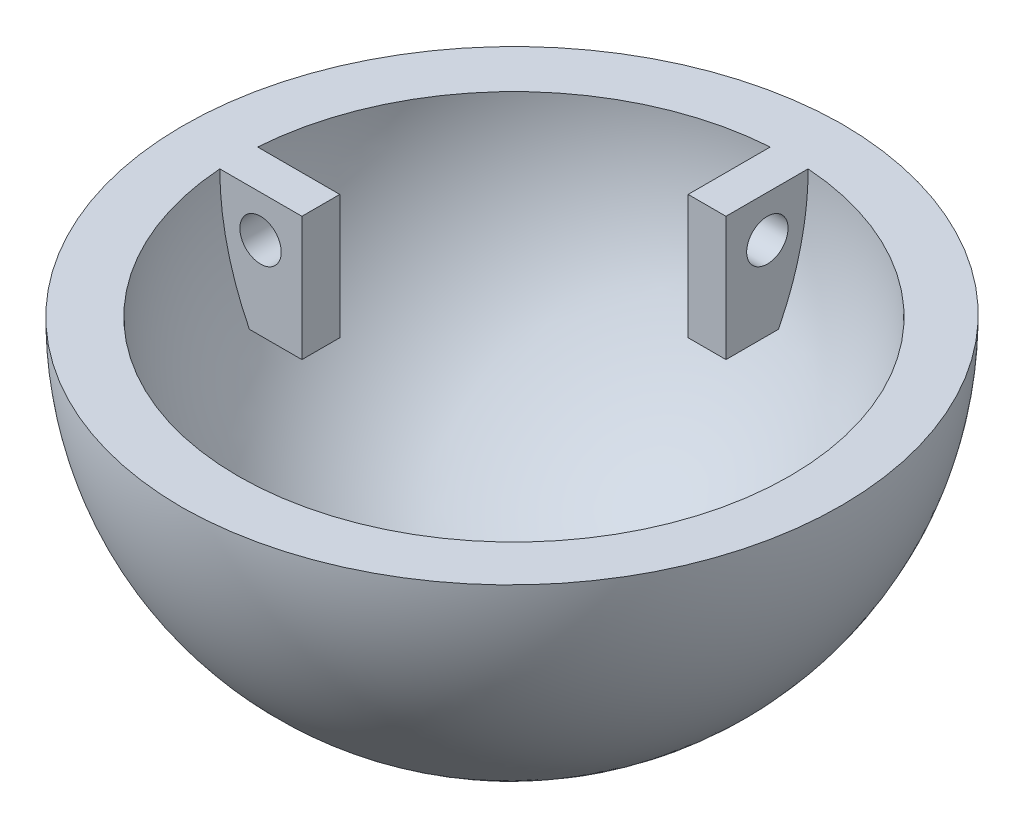
ISO-10303-21;
HEADER;
FILE_DESCRIPTION(('STEP AP214'),'2;1');
FILE_NAME('part.step','',(''),(''),'','','');
FILE_SCHEMA(('AUTOMOTIVE_DESIGN { 1 0 10303 214 1 1 1 1 }'));
ENDSEC;
DATA;
#1=APPLICATION_CONTEXT('core data for automotive mechanical design processes');
#2=APPLICATION_PROTOCOL_DEFINITION('international standard','automotive_design',2000,#1);
#3=PRODUCT_CONTEXT('',#1,'mechanical');
#4=PRODUCT('Part','Part','',(#3));
#5=PRODUCT_RELATED_PRODUCT_CATEGORY('part','',(#4));
#6=PRODUCT_DEFINITION_FORMATION('','',#4);
#7=PRODUCT_DEFINITION_CONTEXT('part definition',#1,'design');
#8=PRODUCT_DEFINITION('design','',#6,#7);
#9=PRODUCT_DEFINITION_SHAPE('','',#8);
#10=(LENGTH_UNIT() NAMED_UNIT(*) SI_UNIT(.MILLI.,.METRE.));
#11=(NAMED_UNIT(*) PLANE_ANGLE_UNIT() SI_UNIT($,.RADIAN.));
#12=(NAMED_UNIT(*) SI_UNIT($,.STERADIAN.) SOLID_ANGLE_UNIT());
#13=UNCERTAINTY_MEASURE_WITH_UNIT(LENGTH_MEASURE(1.E-05),#10,'distance_accuracy_value','');
#14=(GEOMETRIC_REPRESENTATION_CONTEXT(3) GLOBAL_UNCERTAINTY_ASSIGNED_CONTEXT((#13)) GLOBAL_UNIT_ASSIGNED_CONTEXT((#10,
#11,#12)) REPRESENTATION_CONTEXT('',''));
#15=CARTESIAN_POINT('',(0.,0.,0.));
#16=DIRECTION('',(0.,0.,1.));
#17=DIRECTION('',(1.,0.,0.));
#18=AXIS2_PLACEMENT_3D('',#15,#16,#17);
#19=CARTESIAN_POINT('',(-0.140159160321102,0.,0.000818552510422482));
#20=DIRECTION('',(0.,-1.,0.));
#21=DIRECTION('',(0.0116799300267585,0.,0.999931787290798));
#22=AXIS2_PLACEMENT_3D('',#19,#20,#21);
#23=PLANE('',#22);
#24=CARTESIAN_POINT('',(0.,0.,0.));
#25=DIRECTION('',(0.,-1.,0.));
#26=DIRECTION('',(1.,0.,0.));
#27=AXIS2_PLACEMENT_3D('',#24,#25,#26);
#28=CIRCLE('',#27,10.);
#29=CARTESIAN_POINT('',(-0.685861167093749,0.,-9.97645199755268));
#30=VERTEX_POINT('',#29);
#31=CARTESIAN_POINT('',(-9.97645199755268,0.,-0.685861167093786));
#32=VERTEX_POINT('',#31);
#33=EDGE_CURVE('E177',#30,#32,#28,.F.);
#34=ORIENTED_EDGE('',*,*,#33,.F.);
#35=DIRECTION('',(0.,0.,1.));
#36=VECTOR('',#35,1.);
#37=CARTESIAN_POINT('',(-0.685861167093705,0.,-10.9997953601275));
#38=LINE('',#37,#36);
#39=CARTESIAN_POINT('',(-0.685861167093876,0.,-6.99979536012751));
#40=VERTEX_POINT('',#39);
#41=EDGE_CURVE('E140',#30,#40,#38,.T.);
#42=ORIENTED_EDGE('',*,*,#41,.T.);
#43=DIRECTION('',(1.,0.,0.));
#44=VECTOR('',#43,1.);
#45=CARTESIAN_POINT('',(-0.685861167093876,0.,-6.99979536012751));
#46=LINE('',#45,#44);
#47=CARTESIAN_POINT('',(0.685861167093925,0.,-6.9997953601275));
#48=VERTEX_POINT('',#47);
#49=EDGE_CURVE('E126',#40,#48,#46,.T.);
#50=ORIENTED_EDGE('',*,*,#49,.T.);
#51=DIRECTION('',(0.,0.,-1.));
#52=VECTOR('',#51,1.);
#53=CARTESIAN_POINT('',(0.685861167093789,0.,-10.9997953601275));
#54=LINE('',#53,#52);
#55=CARTESIAN_POINT('',(0.685861167093823,0.,-9.97645199755268));
#56=VERTEX_POINT('',#55);
#57=EDGE_CURVE('E120',#48,#56,#54,.T.);
#58=ORIENTED_EDGE('',*,*,#57,.T.);
#59=CARTESIAN_POINT('',(-9.97645199755268,0.,0.685861167093786));
#60=VERTEX_POINT('',#59);
#61=EDGE_CURVE('E185',#60,#56,#28,.F.);
#62=ORIENTED_EDGE('',*,*,#61,.F.);
#63=DIRECTION('',(1.,0.,0.));
#64=VECTOR('',#63,1.);
#65=CARTESIAN_POINT('',(-10.9997953601275,0.,0.685861167093747));
#66=LINE('',#65,#64);
#67=CARTESIAN_POINT('',(-6.9997953601275,0.,0.685861167093901));
#68=VERTEX_POINT('',#67);
#69=EDGE_CURVE('E150',#60,#68,#66,.T.);
#70=ORIENTED_EDGE('',*,*,#69,.T.);
#71=DIRECTION('',(0.,0.,-1.));
#72=VECTOR('',#71,1.);
#73=CARTESIAN_POINT('',(-6.9997953601275,0.,0.685861167093901));
#74=LINE('',#73,#72);
#75=CARTESIAN_POINT('',(-6.9997953601275,0.,-0.685861167093901));
#76=VERTEX_POINT('',#75);
#77=EDGE_CURVE('E167',#68,#76,#74,.T.);
#78=ORIENTED_EDGE('',*,*,#77,.T.);
#79=DIRECTION('',(-1.,0.,0.));
#80=VECTOR('',#79,1.);
#81=CARTESIAN_POINT('',(-10.9997953601275,0.,-0.685861167093747));
#82=LINE('',#81,#80);
#83=EDGE_CURVE('E156',#76,#32,#82,.T.);
#84=ORIENTED_EDGE('',*,*,#83,.T.);
#85=EDGE_LOOP('',(#34,#42,#50,#58,#62,#70,#78,#84));
#86=FACE_BOUND('',#85,.T.);
#87=CARTESIAN_POINT('',(-0.140159160321102,0.,0.000818552510422482));
#88=DIRECTION('',(0.,-1.,0.));
#89=DIRECTION('',(0.0116799300267585,0.,0.999931787290798));
#90=AXIS2_PLACEMENT_3D('',#87,#88,#89);
#91=CIRCLE('',#90,12.);
#92=CARTESIAN_POINT('',(-0.140159160321102,0.,-11.9991814474896));
#93=VERTEX_POINT('',#92);
#94=CARTESIAN_POINT('',(0.,0.,12.));
#95=VERTEX_POINT('',#94);
#96=EDGE_CURVE('E184',#93,#95,#91,.T.);
#97=ORIENTED_EDGE('',*,*,#96,.F.);
#98=CARTESIAN_POINT('',(0.,0.,0.));
#99=DIRECTION('',(0.,1.,0.));
#100=DIRECTION('',(0.,0.,1.));
#101=AXIS2_PLACEMENT_3D('',#98,#99,#100);
#102=CIRCLE('',#101,12.);
#103=EDGE_CURVE('E181',#93,#95,#102,.T.);
#104=ORIENTED_EDGE('',*,*,#103,.T.);
#105=EDGE_LOOP('',(#97,#104));
#106=FACE_BOUND('',#105,.T.);
#107=ADVANCED_FACE('F41',(#86,#106),#23,.F.);
#108=CARTESIAN_POINT('',(0.,0.,0.));
#109=DIRECTION('',(0.,-1.,0.));
#110=DIRECTION('',(-0.999982946677292,0.,0.00584006460588562));
#111=AXIS2_PLACEMENT_3D('',#108,#109,#110);
#112=CIRCLE('',#111,12.);
#113=TRIMMED_CURVE('',#112,(PARAMETER_VALUE(-1.56495622899128)),
(PARAMETER_VALUE(1.56495622899128)),.T.,.PARAMETER.);
#114=CARTESIAN_POINT('',(-0.0700795801605511,0.,0.000409276255212976));
#115=DIRECTION('',(-0.00584006460588562,0.,-0.999982946677292));
#116=AXIS1_PLACEMENT('',#114,#115);
#117=SURFACE_OF_REVOLUTION('',#113,#116);
#118=ORIENTED_EDGE('',*,*,#96,.T.);
#119=ORIENTED_EDGE('',*,*,#103,.F.);
#120=EDGE_LOOP('',(#118,#119));
#121=FACE_BOUND('',#120,.T.);
#122=ADVANCED_FACE('F43',(#121),#117,.T.);
#123=CARTESIAN_POINT('',(0.,0.,0.));
#124=DIRECTION('',(0.,0.,1.));
#125=DIRECTION('',(-1.,0.,0.));
#126=AXIS2_PLACEMENT_3D('',#123,#124,#125);
#127=SPHERICAL_SURFACE('',#126,10.);
#128=CARTESIAN_POINT('',(-0.685861167094176,0.,0.));
#129=DIRECTION('',(-1.,0.,0.));
#130=DIRECTION('',(0.,0.,1.));
#131=AXIS2_PLACEMENT_3D('',#128,#129,#130);
#132=CIRCLE('',#131,9.97645199755265);
#133=CARTESIAN_POINT('',(-0.685861167093763,-4.5,-8.9039089426764));
#134=VERTEX_POINT('',#133);
#135=EDGE_CURVE('E11',#30,#134,#132,.T.);
#136=ORIENTED_EDGE('',*,*,#135,.F.);
#137=ORIENTED_EDGE('',*,*,#33,.T.);
#138=CARTESIAN_POINT('',(0.,0.,-0.68586116709417));
#139=DIRECTION('',(0.,0.,-1.));
#140=DIRECTION('',(-1.,0.,0.));
#141=AXIS2_PLACEMENT_3D('',#138,#139,#140);
#142=CIRCLE('',#141,9.97645199755265);
#143=CARTESIAN_POINT('',(-8.90390894267637,-4.50000000000006,-0.685861167093828));
#144=VERTEX_POINT('',#143);
#145=EDGE_CURVE('E199',#144,#32,#142,.T.);
#146=ORIENTED_EDGE('',*,*,#145,.F.);
#147=CARTESIAN_POINT('',(0.,-4.5,0.));
#148=DIRECTION('',(0.,-1.,0.));
#149=DIRECTION('',(1.,0.,0.));
#150=AXIS2_PLACEMENT_3D('',#147,#148,#149);
#151=CIRCLE('',#150,8.93028554974588);
#152=CARTESIAN_POINT('',(-8.90390894267637,-4.50000000000006,0.685861167093827));
#153=VERTEX_POINT('',#152);
#154=EDGE_CURVE('E189',#153,#144,#151,.T.);
#155=ORIENTED_EDGE('',*,*,#154,.F.);
#156=CARTESIAN_POINT('',(0.,0.,0.68586116709417));
#157=DIRECTION('',(0.,0.,1.));
#158=DIRECTION('',(1.,0.,0.));
#159=AXIS2_PLACEMENT_3D('',#156,#157,#158);
#160=CIRCLE('',#159,9.97645199755265);
#161=EDGE_CURVE('E195',#60,#153,#160,.T.);
#162=ORIENTED_EDGE('',*,*,#161,.F.);
#163=ORIENTED_EDGE('',*,*,#61,.T.);
#164=CARTESIAN_POINT('',(0.685861167094164,0.,0.));
#165=DIRECTION('',(1.,0.,0.));
#166=DIRECTION('',(0.,0.,-1.));
#167=AXIS2_PLACEMENT_3D('',#164,#165,#166);
#168=CIRCLE('',#167,9.97645199755265);
#169=CARTESIAN_POINT('',(0.685861167093892,-4.49999999999999,-8.9039089426764));
#170=VERTEX_POINT('',#169);
#171=EDGE_CURVE('E50',#170,#56,#168,.T.);
#172=ORIENTED_EDGE('',*,*,#171,.F.);
#173=CARTESIAN_POINT('',(0.,-4.5,0.));
#174=DIRECTION('',(0.,1.,0.));
#175=DIRECTION('',(-1.,0.,0.));
#176=AXIS2_PLACEMENT_3D('',#173,#174,#175);
#177=CIRCLE('',#176,8.93028554974588);
#178=EDGE_CURVE('E57',#170,#134,#177,.T.);
#179=ORIENTED_EDGE('',*,*,#178,.T.);
#180=EDGE_LOOP('',(#136,#137,#146,#155,#162,#163,#172,#179));
#181=FACE_BOUND('',#180,.T.);
#182=ADVANCED_FACE('F213',(#181),#127,.F.);
#183=CARTESIAN_POINT('',(-10.9997953601275,-4.50000000000008,-0.685861167093747));
#184=DIRECTION('',(0.,0.,-1.));
#185=DIRECTION('',(-1.,0.,0.));
#186=AXIS2_PLACEMENT_3D('',#183,#184,#185);
#187=PLANE('',#186);
#188=CARTESIAN_POINT('',(-8.49979536012753,-1.50000000000005,-0.685861167094497));
#189=DIRECTION('',(0.,0.,-1.));
#190=DIRECTION('',(-1.,0.,0.));
#191=AXIS2_PLACEMENT_3D('',#188,#189,#190);
#192=CIRCLE('',#191,0.75);
#193=CARTESIAN_POINT('',(-9.24979536012753,-1.50000000000005,-0.685861167094527));
#194=VERTEX_POINT('',#193);
#195=EDGE_CURVE('E143',#194,#194,#192,.T.);
#196=ORIENTED_EDGE('',*,*,#195,.F.);
#197=EDGE_LOOP('',(#196));
#198=FACE_BOUND('',#197,.T.);
#199=DIRECTION('',(-1.,0.,0.));
#200=VECTOR('',#199,1.);
#201=CARTESIAN_POINT('',(-10.9997953601275,-4.50000000000008,-0.685861167093747));
#202=LINE('',#201,#200);
#203=CARTESIAN_POINT('',(-6.99979536012747,-4.50000000000005,-0.685861167093901));
#204=VERTEX_POINT('',#203);
#205=EDGE_CURVE('E160',#204,#144,#202,.T.);
#206=ORIENTED_EDGE('',*,*,#205,.T.);
#207=ORIENTED_EDGE('',*,*,#145,.T.);
#208=ORIENTED_EDGE('',*,*,#83,.F.);
#209=DIRECTION('',(0.,1.,0.));
#210=VECTOR('',#209,1.);
#211=CARTESIAN_POINT('',(-6.99979536012747,-4.50000000000005,-0.685861167093901));
#212=LINE('',#211,#210);
#213=EDGE_CURVE('E174',#204,#76,#212,.T.);
#214=ORIENTED_EDGE('',*,*,#213,.F.);
#215=EDGE_LOOP('',(#206,#207,#208,#214));
#216=FACE_BOUND('',#215,.T.);
#217=ADVANCED_FACE('F215',(#198,#216),#187,.T.);
#218=CARTESIAN_POINT('',(-10.9997953601275,-4.50000000000008,0.685861167093747));
#219=DIRECTION('',(0.,0.,1.));
#220=DIRECTION('',(1.,0.,0.));
#221=AXIS2_PLACEMENT_3D('',#218,#219,#220);
#222=PLANE('',#221);
#223=CARTESIAN_POINT('',(-8.49979536012758,-1.50000000000005,0.685861167093843));
#224=DIRECTION('',(0.,0.,1.));
#225=DIRECTION('',(1.,0.,0.));
#226=AXIS2_PLACEMENT_3D('',#223,#224,#225);
#227=CIRCLE('',#226,0.75);
#228=CARTESIAN_POINT('',(-9.24979536012758,-1.50000000000005,0.685861167093816));
#229=VERTEX_POINT('',#228);
#230=EDGE_CURVE('E349',#229,#229,#227,.F.);
#231=ORIENTED_EDGE('',*,*,#230,.T.);
#232=EDGE_LOOP('',(#231));
#233=FACE_BOUND('',#232,.T.);
#234=ORIENTED_EDGE('',*,*,#69,.F.);
#235=ORIENTED_EDGE('',*,*,#161,.T.);
#236=DIRECTION('',(1.,0.,0.));
#237=VECTOR('',#236,1.);
#238=CARTESIAN_POINT('',(-10.9997953601275,-4.50000000000008,0.685861167093747));
#239=LINE('',#238,#237);
#240=CARTESIAN_POINT('',(-6.99979536012747,-4.50000000000005,0.685861167093901));
#241=VERTEX_POINT('',#240);
#242=EDGE_CURVE('E152',#153,#241,#239,.T.);
#243=ORIENTED_EDGE('',*,*,#242,.T.);
#244=DIRECTION('',(0.,1.,0.));
#245=VECTOR('',#244,1.);
#246=CARTESIAN_POINT('',(-6.99979536012747,-4.50000000000005,0.685861167093901));
#247=LINE('',#246,#245);
#248=EDGE_CURVE('E164',#241,#68,#247,.T.);
#249=ORIENTED_EDGE('',*,*,#248,.T.);
#250=EDGE_LOOP('',(#234,#235,#243,#249));
#251=FACE_BOUND('',#250,.T.);
#252=ADVANCED_FACE('F221',(#233,#251),#222,.T.);
#253=CARTESIAN_POINT('',(0.,-4.5,0.));
#254=DIRECTION('',(0.,-1.,0.));
#255=DIRECTION('',(1.,0.,0.));
#256=AXIS2_PLACEMENT_3D('',#253,#254,#255);
#257=PLANE('',#256);
#258=ORIENTED_EDGE('',*,*,#242,.F.);
#259=ORIENTED_EDGE('',*,*,#154,.T.);
#260=ORIENTED_EDGE('',*,*,#205,.F.);
#261=DIRECTION('',(0.,0.,-1.));
#262=VECTOR('',#261,1.);
#263=CARTESIAN_POINT('',(-6.99979536012747,-4.50000000000005,0.685861167093901));
#264=LINE('',#263,#262);
#265=EDGE_CURVE('E155',#241,#204,#264,.T.);
#266=ORIENTED_EDGE('',*,*,#265,.F.);
#267=EDGE_LOOP('',(#258,#259,#260,#266));
#268=FACE_BOUND('',#267,.T.);
#269=ADVANCED_FACE('F266',(#268),#257,.T.);
#270=CARTESIAN_POINT('',(-6.99979536012747,-4.50000000000005,0.685861167093901));
#271=DIRECTION('',(1.,0.,0.));
#272=DIRECTION('',(0.,1.,0.));
#273=AXIS2_PLACEMENT_3D('',#270,#271,#272);
#274=PLANE('',#273);
#275=ORIENTED_EDGE('',*,*,#77,.F.);
#276=ORIENTED_EDGE('',*,*,#248,.F.);
#277=ORIENTED_EDGE('',*,*,#265,.T.);
#278=ORIENTED_EDGE('',*,*,#213,.T.);
#279=EDGE_LOOP('',(#275,#276,#277,#278));
#280=FACE_BOUND('',#279,.T.);
#281=ADVANCED_FACE('F274',(#280),#274,.T.);
#282=CARTESIAN_POINT('',(-0.685861167093674,-4.5,-10.9997953601275));
#283=DIRECTION('',(-1.,0.,0.));
#284=DIRECTION('',(0.,0.,1.));
#285=AXIS2_PLACEMENT_3D('',#282,#283,#284);
#286=PLANE('',#285);
#287=CARTESIAN_POINT('',(-0.685861167093802,-1.5,-8.49979536012746));
#288=DIRECTION('',(-1.,0.,0.));
#289=DIRECTION('',(0.,0.,1.));
#290=AXIS2_PLACEMENT_3D('',#287,#288,#289);
#291=CIRCLE('',#290,0.75);
#292=CARTESIAN_POINT('',(-0.685861167093769,-1.5,-9.24979536012746));
#293=VERTEX_POINT('',#292);
#294=EDGE_CURVE('E344',#293,#293,#291,.F.);
#295=ORIENTED_EDGE('',*,*,#294,.T.);
#296=EDGE_LOOP('',(#295));
#297=FACE_BOUND('',#296,.T.);
#298=ORIENTED_EDGE('',*,*,#41,.F.);
#299=ORIENTED_EDGE('',*,*,#135,.T.);
#300=DIRECTION('',(0.,0.,1.));
#301=VECTOR('',#300,1.);
#302=CARTESIAN_POINT('',(-0.685861167093674,-4.5,-10.9997953601275));
#303=LINE('',#302,#301);
#304=CARTESIAN_POINT('',(-0.685861167093845,-4.5,-6.99979536012751));
#305=VERTEX_POINT('',#304);
#306=EDGE_CURVE('E110',#134,#305,#303,.T.);
#307=ORIENTED_EDGE('',*,*,#306,.T.);
#308=DIRECTION('',(0.,1.,0.));
#309=VECTOR('',#308,1.);
#310=CARTESIAN_POINT('',(-0.685861167093845,-4.5,-6.99979536012751));
#311=LINE('',#310,#309);
#312=EDGE_CURVE('E114',#305,#40,#311,.T.);
#313=ORIENTED_EDGE('',*,*,#312,.T.);
#314=EDGE_LOOP('',(#298,#299,#307,#313));
#315=FACE_BOUND('',#314,.T.);
#316=ADVANCED_FACE('F113',(#297,#315),#286,.T.);
#317=CARTESIAN_POINT('',(0.68586116709382,-4.49999999999999,-10.9997953601275));
#318=DIRECTION('',(1.,0.,0.));
#319=DIRECTION('',(0.,0.,-1.));
#320=AXIS2_PLACEMENT_3D('',#317,#318,#319);
#321=PLANE('',#320);
#322=CARTESIAN_POINT('',(0.685861167093884,-1.49999999999999,-8.4997953601275));
#323=DIRECTION('',(1.,0.,0.));
#324=DIRECTION('',(0.,0.,-1.));
#325=AXIS2_PLACEMENT_3D('',#322,#323,#324);
#326=CIRCLE('',#325,0.75);
#327=CARTESIAN_POINT('',(0.685861167093859,-1.49999999999999,-9.2497953601275));
#328=VERTEX_POINT('',#327);
#329=EDGE_CURVE('E347',#328,#328,#326,.T.);
#330=ORIENTED_EDGE('',*,*,#329,.F.);
#331=EDGE_LOOP('',(#330));
#332=FACE_BOUND('',#331,.T.);
#333=DIRECTION('',(0.,0.,-1.));
#334=VECTOR('',#333,1.);
#335=CARTESIAN_POINT('',(0.68586116709382,-4.49999999999999,-10.9997953601275));
#336=LINE('',#335,#334);
#337=CARTESIAN_POINT('',(0.685861167093957,-4.49999999999999,-6.9997953601275));
#338=VERTEX_POINT('',#337);
#339=EDGE_CURVE('E129',#338,#170,#336,.T.);
#340=ORIENTED_EDGE('',*,*,#339,.T.);
#341=ORIENTED_EDGE('',*,*,#171,.T.);
#342=ORIENTED_EDGE('',*,*,#57,.F.);
#343=DIRECTION('',(0.,1.,0.));
#344=VECTOR('',#343,1.);
#345=CARTESIAN_POINT('',(0.685861167093957,-4.49999999999999,-6.9997953601275));
#346=LINE('',#345,#344);
#347=EDGE_CURVE('E128',#338,#48,#346,.T.);
#348=ORIENTED_EDGE('',*,*,#347,.F.);
#349=EDGE_LOOP('',(#340,#341,#342,#348));
#350=FACE_BOUND('',#349,.T.);
#351=ADVANCED_FACE('F207',(#332,#350),#321,.T.);
#352=CARTESIAN_POINT('',(0.,-4.5,0.));
#353=DIRECTION('',(0.,1.,0.));
#354=DIRECTION('',(-1.,0.,0.));
#355=AXIS2_PLACEMENT_3D('',#352,#353,#354);
#356=PLANE('',#355);
#357=ORIENTED_EDGE('',*,*,#178,.F.);
#358=ORIENTED_EDGE('',*,*,#339,.F.);
#359=DIRECTION('',(1.,0.,0.));
#360=VECTOR('',#359,1.);
#361=CARTESIAN_POINT('',(-0.685861167093845,-4.5,-6.99979536012751));
#362=LINE('',#361,#360);
#363=EDGE_CURVE('E119',#305,#338,#362,.T.);
#364=ORIENTED_EDGE('',*,*,#363,.F.);
#365=ORIENTED_EDGE('',*,*,#306,.F.);
#366=EDGE_LOOP('',(#357,#358,#364,#365));
#367=FACE_BOUND('',#366,.T.);
#368=ADVANCED_FACE('F132',(#367),#356,.F.);
#369=CARTESIAN_POINT('',(-0.685861167093845,-4.5,-6.99979536012751));
#370=DIRECTION('',(0.,0.,1.));
#371=DIRECTION('',(1.,0.,0.));
#372=AXIS2_PLACEMENT_3D('',#369,#370,#371);
#373=PLANE('',#372);
#374=ORIENTED_EDGE('',*,*,#49,.F.);
#375=ORIENTED_EDGE('',*,*,#312,.F.);
#376=ORIENTED_EDGE('',*,*,#363,.T.);
#377=ORIENTED_EDGE('',*,*,#347,.T.);
#378=EDGE_LOOP('',(#374,#375,#376,#377));
#379=FACE_BOUND('',#378,.T.);
#380=ADVANCED_FACE('F124',(#379),#373,.T.);
#381=CARTESIAN_POINT('',(-8.49979536012801,-1.50000000000005,12.0010000000001));
#382=DIRECTION('',(0.,0.,-1.));
#383=DIRECTION('',(-1.,0.,0.));
#384=AXIS2_PLACEMENT_3D('',#381,#382,#383);
#385=CYLINDRICAL_SURFACE('',#384,0.75);
#386=CARTESIAN_POINT('',(-9.24979536012758,-1.50000000000005,0.685861167093816));
#387=CARTESIAN_POINT('',(-9.24979536012758,-1.50000000000005,0.671572392779353));
#388=CARTESIAN_POINT('',(-9.24979536012758,-1.50000000000005,0.657283618464891));
#389=CARTESIAN_POINT('',(-9.24979536012758,-1.50000000000005,0.628706069835968));
#390=CARTESIAN_POINT('',(-9.24979536012757,-1.50000000000005,0.614417295521506));
#391=CARTESIAN_POINT('',(-9.24979536012757,-1.50000000000005,0.585839746892583));
#392=CARTESIAN_POINT('',(-9.24979536012757,-1.50000000000005,0.57155097257812));
#393=CARTESIAN_POINT('',(-9.24979536012757,-1.50000000000005,0.542973423949197));
#394=CARTESIAN_POINT('',(-9.24979536012757,-1.50000000000005,0.528684649634735));
#395=CARTESIAN_POINT('',(-9.24979536012757,-1.50000000000005,0.500107101005812));
#396=CARTESIAN_POINT('',(-9.24979536012757,-1.50000000000005,0.485818326691349));
#397=CARTESIAN_POINT('',(-9.24979536012757,-1.50000000000005,0.457240778062425));
#398=CARTESIAN_POINT('',(-9.24979536012757,-1.50000000000005,0.442952003747963));
#399=CARTESIAN_POINT('',(-9.24979536012757,-1.50000000000005,0.414374455119039));
#400=CARTESIAN_POINT('',(-9.24979536012757,-1.50000000000005,0.400085680804578));
#401=CARTESIAN_POINT('',(-9.24979536012757,-1.50000000000005,0.371508132175654));
#402=CARTESIAN_POINT('',(-9.24979536012756,-1.50000000000005,0.357219357861192));
#403=CARTESIAN_POINT('',(-9.24979536012756,-1.50000000000005,0.328641809232268));
#404=CARTESIAN_POINT('',(-9.24979536012756,-1.50000000000005,0.314353034917806));
#405=CARTESIAN_POINT('',(-9.24979536012756,-1.50000000000005,0.285775486288882));
#406=CARTESIAN_POINT('',(-9.24979536012756,-1.50000000000005,0.271486711974421));
#407=CARTESIAN_POINT('',(-9.24979536012756,-1.50000000000005,0.242909163345497));
#408=CARTESIAN_POINT('',(-9.24979536012756,-1.50000000000005,0.228620389031035));
#409=CARTESIAN_POINT('',(-9.24979536012756,-1.50000000000005,0.200042840402111));
#410=CARTESIAN_POINT('',(-9.24979536012756,-1.50000000000005,0.185754066087648));
#411=CARTESIAN_POINT('',(-9.24979536012756,-1.50000000000005,0.157176517458725));
#412=CARTESIAN_POINT('',(-9.24979536012756,-1.50000000000005,0.142887743144263));
#413=CARTESIAN_POINT('',(-9.24979536012756,-1.50000000000005,0.11431019451534));
#414=CARTESIAN_POINT('',(-9.24979536012756,-1.50000000000005,0.100021420200877));
#415=CARTESIAN_POINT('',(-9.24979536012756,-1.50000000000005,0.0714438715719538));
#416=CARTESIAN_POINT('',(-9.24979536012756,-1.50000000000005,0.0571550972574923));
#417=CARTESIAN_POINT('',(-9.24979536012756,-1.50000000000005,0.0285775486285686));
#418=CARTESIAN_POINT('',(-9.24979536012755,-1.50000000000005,0.0142887743141065));
#419=CARTESIAN_POINT('',(-9.24979536012755,-1.50000000000005,-0.0142887743148177));
#420=CARTESIAN_POINT('',(-9.24979536012755,-1.50000000000005,-0.0285775486292799));
#421=CARTESIAN_POINT('',(-9.24979536012755,-1.50000000000005,-0.0571550972582035));
#422=CARTESIAN_POINT('',(-9.24979536012755,-1.50000000000005,-0.071443871572665));
#423=CARTESIAN_POINT('',(-9.24979536012755,-1.50000000000005,-0.100021420201589));
#424=CARTESIAN_POINT('',(-9.24979536012755,-1.50000000000005,-0.114310194516051));
#425=CARTESIAN_POINT('',(-9.24979536012755,-1.50000000000005,-0.142887743144974));
#426=CARTESIAN_POINT('',(-9.24979536012755,-1.50000000000005,-0.157176517459436));
#427=CARTESIAN_POINT('',(-9.24979536012755,-1.50000000000005,-0.18575406608836));
#428=CARTESIAN_POINT('',(-9.24979536012754,-1.50000000000005,-0.200042840402822));
#429=CARTESIAN_POINT('',(-9.24979536012754,-1.50000000000005,-0.228620389031746));
#430=CARTESIAN_POINT('',(-9.24979536012754,-1.50000000000005,-0.242909163346208));
#431=CARTESIAN_POINT('',(-9.24979536012754,-1.50000000000005,-0.271486711975132));
#432=CARTESIAN_POINT('',(-9.24979536012754,-1.50000000000005,-0.285775486289593));
#433=CARTESIAN_POINT('',(-9.24979536012754,-1.50000000000005,-0.314353034918517));
#434=CARTESIAN_POINT('',(-9.24979536012754,-1.50000000000005,-0.328641809232979));
#435=CARTESIAN_POINT('',(-9.24979536012754,-1.50000000000005,-0.357219357861903));
#436=CARTESIAN_POINT('',(-9.24979536012754,-1.50000000000005,-0.371508132176365));
#437=CARTESIAN_POINT('',(-9.24979536012754,-1.50000000000005,-0.400085680805289));
#438=CARTESIAN_POINT('',(-9.24979536012754,-1.50000000000005,-0.414374455119751));
#439=CARTESIAN_POINT('',(-9.24979536012754,-1.50000000000005,-0.442952003748674));
#440=CARTESIAN_POINT('',(-9.24979536012753,-1.50000000000005,-0.457240778063136));
#441=CARTESIAN_POINT('',(-9.24979536012753,-1.50000000000005,-0.485818326692061));
#442=CARTESIAN_POINT('',(-9.24979536012753,-1.50000000000005,-0.500107101006523));
#443=CARTESIAN_POINT('',(-9.24979536012753,-1.50000000000005,-0.528684649635446));
#444=CARTESIAN_POINT('',(-9.24979536012753,-1.50000000000005,-0.542973423949908));
#445=CARTESIAN_POINT('',(-9.24979536012753,-1.50000000000005,-0.571550972578832));
#446=CARTESIAN_POINT('',(-9.24979536012753,-1.50000000000005,-0.585839746893294));
#447=CARTESIAN_POINT('',(-9.24979536012753,-1.50000000000005,-0.614417295522217));
#448=CARTESIAN_POINT('',(-9.24979536012753,-1.50000000000005,-0.628706069836679));
#449=CARTESIAN_POINT('',(-9.24979536012753,-1.50000000000005,-0.657283618465603));
#450=CARTESIAN_POINT('',(-9.24979536012753,-1.50000000000005,-0.671572392780065));
#451=CARTESIAN_POINT('',(-9.24979536012753,-1.50000000000005,-0.685861167094527));
#452=B_SPLINE_CURVE_WITH_KNOTS('',3,(#386,#387,#388,#389,#390,#391,#392,#393,#394,#395,#396,
#397,#398,#399,#400,#401,#402,#403,#404,#405,#406,#407,#408,#409,#410,#411,#412,#413,#414,#415,
#416,#417,#418,#419,#420,#421,#422,#423,#424,#425,#426,#427,#428,#429,#430,#431,#432,#433,#434,
#435,#436,#437,#438,#439,#440,#441,#442,#443,#444,#445,#446,#447,#448,#449,#450,#451),
.UNSPECIFIED.,.F.,.F.,(4,2,2,2,2,2,2,2,2,2,2,2,2,2,2,2,2,2,2,2,2,2,2,2,2,2,2,2,2,2,2,2,4),(0.,
0.0428663229433864,0.085732645886771,0.128598968830157,0.171465291773542,0.214331614716928,
0.257197937660315,0.300064260603699,0.342930583547086,0.385796906490472,0.428663229433857,
0.471529552377243,0.514395875320629,0.557262198264014,0.6001285212074,0.642994844150785,
0.685861167094171,0.728727490037558,0.771593812980942,0.814460135924329,0.857326458867713,
0.9001927818111,0.943059104754486,0.985925427697871,1.02879175064126,1.07165807358464,
1.11452439652803,1.15739071947141,1.2002570424148,1.24312336535819,1.28598968830157,
1.32885601124496,1.37172233418834),.UNSPECIFIED.);
#453=EDGE_CURVE('BSEAM314',#229,#194,#452,.T.);
#454=ORIENTED_EDGE('',*,*,#230,.F.);
#455=ORIENTED_EDGE('',*,*,#195,.T.);
#456=ORIENTED_EDGE('',*,*,#453,.T.);
#457=ORIENTED_EDGE('',*,*,#453,.F.);
#458=EDGE_LOOP('',(#454,#456,#455,#457));
#459=FACE_BOUND('',#458,.T.);
#460=ADVANCED_FACE('F314',(#459),#385,.F.);
#461=CARTESIAN_POINT('',(-12.0010000000008,-1.50000000000008,-8.49979536012707));
#462=DIRECTION('',(1.,0.,0.));
#463=DIRECTION('',(0.,0.,-1.));
#464=AXIS2_PLACEMENT_3D('',#461,#462,#463);
#465=CYLINDRICAL_SURFACE('',#464,0.75);
#466=CARTESIAN_POINT('',(-0.685861167093769,-1.5,-9.24979536012746));
#467=CARTESIAN_POINT('',(-0.671572392779314,-1.5,-9.24979536012746));
#468=CARTESIAN_POINT('',(-0.65728361846486,-1.5,-9.24979536012746));
#469=CARTESIAN_POINT('',(-0.62870606983595,-1.5,-9.24979536012746));
#470=CARTESIAN_POINT('',(-0.614417295521496,-1.5,-9.24979536012746));
#471=CARTESIAN_POINT('',(-0.585839746892587,-1.5,-9.24979536012746));
#472=CARTESIAN_POINT('',(-0.571550972578133,-1.5,-9.24979536012746));
#473=CARTESIAN_POINT('',(-0.542973423949225,-1.5,-9.24979536012746));
#474=CARTESIAN_POINT('',(-0.52868464963477,-1.5,-9.24979536012746));
#475=CARTESIAN_POINT('',(-0.500107101005861,-1.5,-9.24979536012746));
#476=CARTESIAN_POINT('',(-0.485818326691406,-1.5,-9.24979536012746));
#477=CARTESIAN_POINT('',(-0.457240778062498,-1.5,-9.24979536012746));
#478=CARTESIAN_POINT('',(-0.442952003748043,-1.5,-9.24979536012747));
#479=CARTESIAN_POINT('',(-0.414374455119135,-1.5,-9.24979536012747));
#480=CARTESIAN_POINT('',(-0.40008568080468,-1.5,-9.24979536012747));
#481=CARTESIAN_POINT('',(-0.371508132175771,-1.5,-9.24979536012747));
#482=CARTESIAN_POINT('',(-0.357219357861316,-1.5,-9.24979536012747));
#483=CARTESIAN_POINT('',(-0.328641809232407,-1.5,-9.24979536012747));
#484=CARTESIAN_POINT('',(-0.314353034917953,-1.5,-9.24979536012747));
#485=CARTESIAN_POINT('',(-0.285775486289043,-1.5,-9.24979536012747));
#486=CARTESIAN_POINT('',(-0.271486711974589,-1.5,-9.24979536012747));
#487=CARTESIAN_POINT('',(-0.24290916334568,-1.5,-9.24979536012747));
#488=CARTESIAN_POINT('',(-0.228620389031226,-1.5,-9.24979536012747));
#489=CARTESIAN_POINT('',(-0.200042840402318,-1.5,-9.24979536012747));
#490=CARTESIAN_POINT('',(-0.185754066087863,-1.5,-9.24979536012748));
#491=CARTESIAN_POINT('',(-0.157176517458954,-1.5,-9.24979536012748));
#492=CARTESIAN_POINT('',(-0.142887743144499,-1.5,-9.24979536012748));
#493=CARTESIAN_POINT('',(-0.114310194515591,-1.5,-9.24979536012748));
#494=CARTESIAN_POINT('',(-0.100021420201137,-1.5,-9.24979536012748));
#495=CARTESIAN_POINT('',(-0.0714438715722279,-1.5,-9.24979536012748));
#496=CARTESIAN_POINT('',(-0.0571550972577733,-1.5,-9.24979536012748));
#497=CARTESIAN_POINT('',(-0.0285775486288641,-1.5,-9.24979536012748));
#498=CARTESIAN_POINT('',(-0.0142887743144095,-1.5,-9.24979536012748));
#499=CARTESIAN_POINT('',(0.0142887743144997,-1.5,-9.24979536012748));
#500=CARTESIAN_POINT('',(0.0285775486289543,-1.5,-9.24979536012748));
#501=CARTESIAN_POINT('',(0.0571550972578635,-1.5,-9.24979536012748));
#502=CARTESIAN_POINT('',(0.0714438715723181,-1.5,-9.24979536012748));
#503=CARTESIAN_POINT('',(0.100021420201227,-1.5,-9.24979536012748));
#504=CARTESIAN_POINT('',(0.114310194515681,-1.5,-9.24979536012749));
#505=CARTESIAN_POINT('',(0.142887743144589,-1.5,-9.24979536012749));
#506=CARTESIAN_POINT('',(0.157176517459044,-1.5,-9.24979536012749));
#507=CARTESIAN_POINT('',(0.185754066087953,-1.5,-9.24979536012749));
#508=CARTESIAN_POINT('',(0.200042840402408,-1.5,-9.24979536012749));
#509=CARTESIAN_POINT('',(0.228620389031316,-1.5,-9.24979536012749));
#510=CARTESIAN_POINT('',(0.24290916334577,-1.5,-9.24979536012749));
#511=CARTESIAN_POINT('',(0.271486711974679,-1.5,-9.24979536012749));
#512=CARTESIAN_POINT('',(0.285775486289134,-1.5,-9.24979536012749));
#513=CARTESIAN_POINT('',(0.314353034918043,-1.5,-9.24979536012749));
#514=CARTESIAN_POINT('',(0.328641809232497,-1.5,-9.24979536012749));
#515=CARTESIAN_POINT('',(0.357219357861407,-1.5,-9.24979536012749));
#516=CARTESIAN_POINT('',(0.371508132175861,-1.5,-9.24979536012749));
#517=CARTESIAN_POINT('',(0.40008568080477,-1.5,-9.24979536012749));
#518=CARTESIAN_POINT('',(0.414374455119225,-1.5,-9.24979536012749));
#519=CARTESIAN_POINT('',(0.442952003748134,-1.5,-9.24979536012749));
#520=CARTESIAN_POINT('',(0.457240778062588,-1.5,-9.2497953601275));
#521=CARTESIAN_POINT('',(0.485818326691496,-1.5,-9.2497953601275));
#522=CARTESIAN_POINT('',(0.500107101005951,-1.5,-9.2497953601275));
#523=CARTESIAN_POINT('',(0.52868464963486,-1.5,-9.2497953601275));
#524=CARTESIAN_POINT('',(0.542973423949315,-1.5,-9.2497953601275));
#525=CARTESIAN_POINT('',(0.571550972578223,-1.5,-9.2497953601275));
#526=CARTESIAN_POINT('',(0.585839746892677,-1.5,-9.2497953601275));
#527=CARTESIAN_POINT('',(0.614417295521586,-1.5,-9.2497953601275));
#528=CARTESIAN_POINT('',(0.628706069836041,-1.5,-9.2497953601275));
#529=CARTESIAN_POINT('',(0.65728361846495,-1.5,-9.2497953601275));
#530=CARTESIAN_POINT('',(0.671572392779404,-1.5,-9.2497953601275));
#531=CARTESIAN_POINT('',(0.685861167093859,-1.49999999999999,-9.2497953601275));
#532=B_SPLINE_CURVE_WITH_KNOTS('',3,(#466,#467,#468,#469,#470,#471,#472,#473,#474,#475,#476,
#477,#478,#479,#480,#481,#482,#483,#484,#485,#486,#487,#488,#489,#490,#491,#492,#493,#494,#495,
#496,#497,#498,#499,#500,#501,#502,#503,#504,#505,#506,#507,#508,#509,#510,#511,#512,#513,#514,
#515,#516,#517,#518,#519,#520,#521,#522,#523,#524,#525,#526,#527,#528,#529,#530,#531),
.UNSPECIFIED.,.F.,.F.,(4,2,2,2,2,2,2,2,2,2,2,2,2,2,2,2,2,2,2,2,2,2,2,2,2,2,2,2,2,2,2,2,4),(0.,
0.0428663229433638,0.0857326458867276,0.12859896883009,0.171465291773453,0.214331614716817,
0.257197937660179,0.300064260603543,0.342930583546907,0.385796906490271,0.428663229433635,
0.471529552376997,0.51439587532036,0.557262198263724,0.600128521207086,0.64299484415045,
0.685861167093814,0.728727490037178,0.771593812980542,0.814460135923904,0.857326458867267,
0.900192781810631,0.943059104753993,0.985925427697357,1.02879175064072,1.07165807358408,
1.11452439652745,1.15739071947081,1.20025704241417,1.24312336535754,1.2859896883009,
1.32885601124426,1.37172233418763),.UNSPECIFIED.);
#533=EDGE_CURVE('BSEAM321',#293,#328,#532,.T.);
#534=ORIENTED_EDGE('',*,*,#294,.F.);
#535=ORIENTED_EDGE('',*,*,#329,.T.);
#536=ORIENTED_EDGE('',*,*,#533,.T.);
#537=ORIENTED_EDGE('',*,*,#533,.F.);
#538=EDGE_LOOP('',(#534,#536,#535,#537));
#539=FACE_BOUND('',#538,.T.);
#540=ADVANCED_FACE('F321',(#539),#465,.F.);
#541=CLOSED_SHELL('',(#107,#122,#182,#217,#252,#269,#281,#316,#351,#368,#380,#460,#540));
#542=MANIFOLD_SOLID_BREP('B2',#541);
#543=ADVANCED_BREP_SHAPE_REPRESENTATION('',(#18,#542),#14);
#544=SHAPE_DEFINITION_REPRESENTATION(#9,#543);
ENDSEC;
END-ISO-10303-21;
